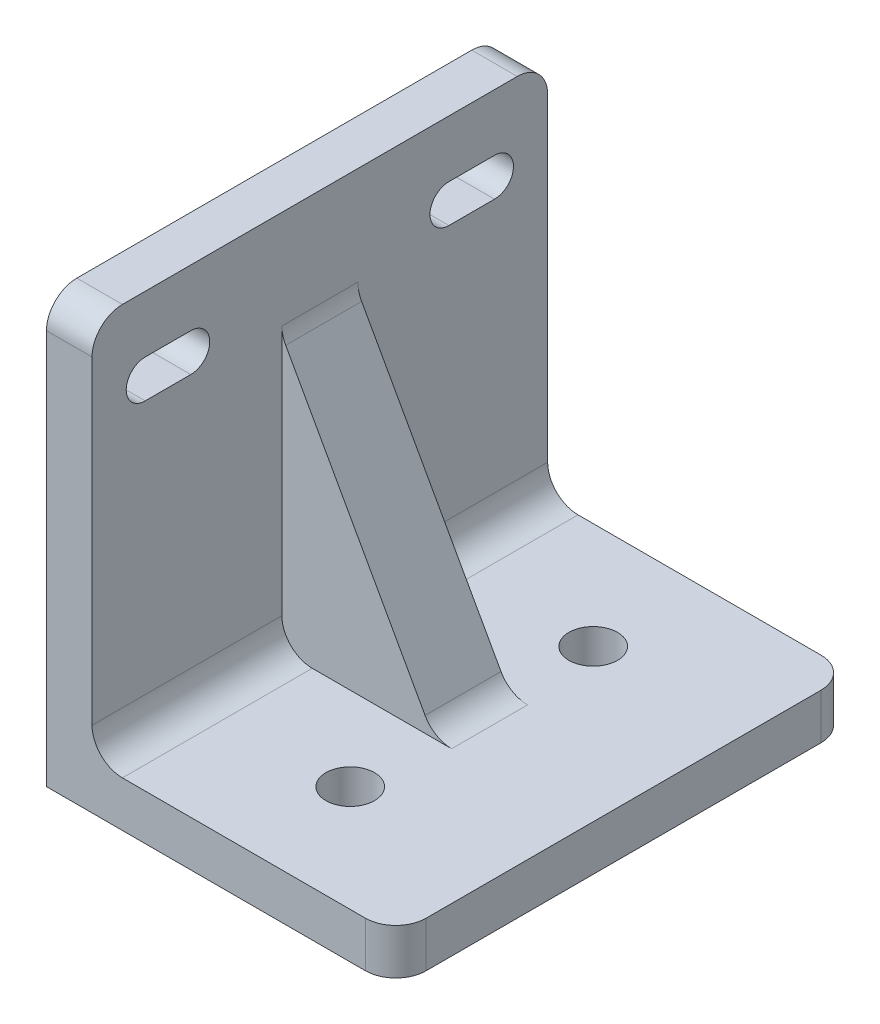
ISO-10303-21;
HEADER;
FILE_DESCRIPTION(('STEP AP214'),'2;1');
FILE_NAME('part.step','',(''),(''),'','','');
FILE_SCHEMA(('AUTOMOTIVE_DESIGN { 1 0 10303 214 1 1 1 1 }'));
ENDSEC;
DATA;
#1=APPLICATION_CONTEXT('core data for automotive mechanical design processes');
#2=APPLICATION_PROTOCOL_DEFINITION('international standard','automotive_design',2000,#1);
#3=PRODUCT_CONTEXT('',#1,'mechanical');
#4=PRODUCT('Part','Part','',(#3));
#5=PRODUCT_RELATED_PRODUCT_CATEGORY('part','',(#4));
#6=PRODUCT_DEFINITION_FORMATION('','',#4);
#7=PRODUCT_DEFINITION_CONTEXT('part definition',#1,'design');
#8=PRODUCT_DEFINITION('design','',#6,#7);
#9=PRODUCT_DEFINITION_SHAPE('','',#8);
#10=(LENGTH_UNIT() NAMED_UNIT(*) SI_UNIT(.MILLI.,.METRE.));
#11=(NAMED_UNIT(*) PLANE_ANGLE_UNIT() SI_UNIT($,.RADIAN.));
#12=(NAMED_UNIT(*) SI_UNIT($,.STERADIAN.) SOLID_ANGLE_UNIT());
#13=UNCERTAINTY_MEASURE_WITH_UNIT(LENGTH_MEASURE(1.E-05),#10,'distance_accuracy_value','');
#14=(GEOMETRIC_REPRESENTATION_CONTEXT(3) GLOBAL_UNCERTAINTY_ASSIGNED_CONTEXT((#13)) GLOBAL_UNIT_ASSIGNED_CONTEXT((#10,
#11,#12)) REPRESENTATION_CONTEXT('',''));
#15=CARTESIAN_POINT('',(0.,0.,0.));
#16=DIRECTION('',(0.,0.,1.));
#17=DIRECTION('',(1.,0.,0.));
#18=AXIS2_PLACEMENT_3D('',#15,#16,#17);
#19=CARTESIAN_POINT('',(20.,0.,15.));
#20=DIRECTION('',(0.,-1.,0.));
#21=DIRECTION('',(1.,0.,0.));
#22=AXIS2_PLACEMENT_3D('',#19,#20,#21);
#23=PLANE('',#22);
#24=CARTESIAN_POINT('',(10.,0.,8.));
#25=DIRECTION('',(0.,1.,0.));
#26=DIRECTION('',(-1.,0.,0.));
#27=AXIS2_PLACEMENT_3D('',#24,#25,#26);
#28=CIRCLE('',#27,1.6);
#29=CARTESIAN_POINT('',(8.4,0.,8.));
#30=VERTEX_POINT('',#29);
#31=EDGE_CURVE('E286',#30,#30,#28,.T.);
#32=ORIENTED_EDGE('',*,*,#31,.F.);
#33=EDGE_LOOP('',(#32));
#34=FACE_BOUND('',#33,.T.);
#35=CARTESIAN_POINT('',(10.,0.,-8.));
#36=DIRECTION('',(0.,1.,0.));
#37=DIRECTION('',(-1.,0.,0.));
#38=AXIS2_PLACEMENT_3D('',#35,#36,#37);
#39=CIRCLE('',#38,1.6);
#40=CARTESIAN_POINT('',(8.4,0.,-8.));
#41=VERTEX_POINT('',#40);
#42=EDGE_CURVE('E285',#41,#41,#39,.T.);
#43=ORIENTED_EDGE('',*,*,#42,.F.);
#44=EDGE_LOOP('',(#43));
#45=FACE_BOUND('',#44,.T.);
#46=DIRECTION('',(-1.,0.,0.));
#47=VECTOR('',#46,1.);
#48=CARTESIAN_POINT('',(20.,0.,15.));
#49=LINE('',#48,#47);
#50=CARTESIAN_POINT('',(18.,0.,15.));
#51=VERTEX_POINT('',#50);
#52=CARTESIAN_POINT('',(2.,0.,15.));
#53=VERTEX_POINT('',#52);
#54=EDGE_CURVE('E292',#51,#53,#49,.T.);
#55=ORIENTED_EDGE('',*,*,#54,.F.);
#56=CARTESIAN_POINT('',(18.,0.,13.));
#57=DIRECTION('',(0.,-1.,0.));
#58=DIRECTION('',(1.,0.,0.));
#59=AXIS2_PLACEMENT_3D('',#56,#57,#58);
#60=CIRCLE('',#59,2.);
#61=CARTESIAN_POINT('',(20.,0.,13.));
#62=VERTEX_POINT('',#61);
#63=EDGE_CURVE('E349',#51,#62,#60,.F.);
#64=ORIENTED_EDGE('',*,*,#63,.T.);
#65=DIRECTION('',(0.,0.,-1.));
#66=VECTOR('',#65,1.);
#67=CARTESIAN_POINT('',(20.,0.,15.));
#68=LINE('',#67,#66);
#69=CARTESIAN_POINT('',(20.,0.,-13.));
#70=VERTEX_POINT('',#69);
#71=EDGE_CURVE('E304',#62,#70,#68,.T.);
#72=ORIENTED_EDGE('',*,*,#71,.T.);
#73=CARTESIAN_POINT('',(18.,0.,-13.));
#74=DIRECTION('',(0.,-1.,0.));
#75=DIRECTION('',(1.,0.,0.));
#76=AXIS2_PLACEMENT_3D('',#73,#74,#75);
#77=CIRCLE('',#76,2.);
#78=CARTESIAN_POINT('',(18.,0.,-15.));
#79=VERTEX_POINT('',#78);
#80=EDGE_CURVE('E347',#70,#79,#77,.F.);
#81=ORIENTED_EDGE('',*,*,#80,.T.);
#82=DIRECTION('',(-1.,0.,0.));
#83=VECTOR('',#82,1.);
#84=CARTESIAN_POINT('',(20.,0.,-15.));
#85=LINE('',#84,#83);
#86=CARTESIAN_POINT('',(2.,0.,-15.));
#87=VERTEX_POINT('',#86);
#88=EDGE_CURVE('E305',#79,#87,#85,.T.);
#89=ORIENTED_EDGE('',*,*,#88,.T.);
#90=DIRECTION('',(0.,0.,-1.));
#91=VECTOR('',#90,1.);
#92=CARTESIAN_POINT('',(2.,0.,-2.5));
#93=LINE('',#92,#91);
#94=CARTESIAN_POINT('',(2.,0.,-2.5));
#95=VERTEX_POINT('',#94);
#96=EDGE_CURVE('E345',#87,#95,#93,.F.);
#97=ORIENTED_EDGE('',*,*,#96,.T.);
#98=DIRECTION('',(-1.,0.,0.));
#99=VECTOR('',#98,1.);
#100=CARTESIAN_POINT('',(20.,0.,-2.5));
#101=LINE('',#100,#99);
#102=CARTESIAN_POINT('',(11.1768066979971,0.,-2.5));
#103=VERTEX_POINT('',#102);
#104=EDGE_CURVE('E407',#103,#95,#101,.T.);
#105=ORIENTED_EDGE('',*,*,#104,.F.);
#106=DIRECTION('',(0.,0.,-1.));
#107=VECTOR('',#106,1.);
#108=CARTESIAN_POINT('',(11.1768066979971,0.,15.));
#109=LINE('',#108,#107);
#110=CARTESIAN_POINT('',(11.1768066979971,0.,2.5));
#111=VERTEX_POINT('',#110);
#112=EDGE_CURVE('E342',#103,#111,#109,.F.);
#113=ORIENTED_EDGE('',*,*,#112,.T.);
#114=DIRECTION('',(-1.,0.,0.));
#115=VECTOR('',#114,1.);
#116=CARTESIAN_POINT('',(20.,0.,2.5));
#117=LINE('',#116,#115);
#118=CARTESIAN_POINT('',(2.,0.,2.5));
#119=VERTEX_POINT('',#118);
#120=EDGE_CURVE('E254',#111,#119,#117,.T.);
#121=ORIENTED_EDGE('',*,*,#120,.T.);
#122=DIRECTION('',(0.,0.,-1.));
#123=VECTOR('',#122,1.);
#124=CARTESIAN_POINT('',(2.,0.,15.));
#125=LINE('',#124,#123);
#126=EDGE_CURVE('E340',#119,#53,#125,.F.);
#127=ORIENTED_EDGE('',*,*,#126,.T.);
#128=EDGE_LOOP('',(#55,#64,#72,#81,#89,#97,#105,#113,#121,#127));
#129=FACE_BOUND('',#128,.T.);
#130=ADVANCED_FACE('F41',(#34,#45,#129),#23,.F.);
#131=CARTESIAN_POINT('',(0.,0.,15.));
#132=DIRECTION('',(-1.,0.,0.));
#133=DIRECTION('',(0.,-1.,0.));
#134=AXIS2_PLACEMENT_3D('',#131,#132,#133);
#135=PLANE('',#134);
#136=DIRECTION('',(0.,0.,-1.));
#137=VECTOR('',#136,1.);
#138=CARTESIAN_POINT('',(0.,21.25,15.));
#139=LINE('',#138,#137);
#140=CARTESIAN_POINT('',(0.,21.25,-8.5));
#141=VERTEX_POINT('',#140);
#142=CARTESIAN_POINT('',(0.,21.25,-11.5));
#143=VERTEX_POINT('',#142);
#144=EDGE_CURVE('E279',#141,#143,#139,.T.);
#145=ORIENTED_EDGE('',*,*,#144,.T.);
#146=CARTESIAN_POINT('',(0.,20.,-11.5));
#147=DIRECTION('',(-1.,0.,0.));
#148=DIRECTION('',(0.,-1.,0.));
#149=AXIS2_PLACEMENT_3D('',#146,#147,#148);
#150=CIRCLE('',#149,1.25);
#151=CARTESIAN_POINT('',(0.,18.75,-11.5));
#152=VERTEX_POINT('',#151);
#153=EDGE_CURVE('E282',#143,#152,#150,.T.);
#154=ORIENTED_EDGE('',*,*,#153,.T.);
#155=DIRECTION('',(0.,0.,1.));
#156=VECTOR('',#155,1.);
#157=CARTESIAN_POINT('',(0.,18.75,15.));
#158=LINE('',#157,#156);
#159=CARTESIAN_POINT('',(0.,18.75,-8.5));
#160=VERTEX_POINT('',#159);
#161=EDGE_CURVE('E276',#152,#160,#158,.T.);
#162=ORIENTED_EDGE('',*,*,#161,.T.);
#163=CARTESIAN_POINT('',(0.,20.,-8.5));
#164=DIRECTION('',(-1.,0.,0.));
#165=DIRECTION('',(0.,-1.,0.));
#166=AXIS2_PLACEMENT_3D('',#163,#164,#165);
#167=CIRCLE('',#166,1.25);
#168=EDGE_CURVE('E216',#160,#141,#167,.T.);
#169=ORIENTED_EDGE('',*,*,#168,.T.);
#170=EDGE_LOOP('',(#145,#154,#162,#169));
#171=FACE_BOUND('',#170,.T.);
#172=DIRECTION('',(0.,0.,1.));
#173=VECTOR('',#172,1.);
#174=CARTESIAN_POINT('',(0.,18.75,15.));
#175=LINE('',#174,#173);
#176=CARTESIAN_POINT('',(0.,18.75,8.5));
#177=VERTEX_POINT('',#176);
#178=CARTESIAN_POINT('',(0.,18.75,11.5));
#179=VERTEX_POINT('',#178);
#180=EDGE_CURVE('E270',#177,#179,#175,.T.);
#181=ORIENTED_EDGE('',*,*,#180,.T.);
#182=CARTESIAN_POINT('',(0.,20.,11.5));
#183=DIRECTION('',(-1.,0.,0.));
#184=DIRECTION('',(0.,-1.,0.));
#185=AXIS2_PLACEMENT_3D('',#182,#183,#184);
#186=CIRCLE('',#185,1.25);
#187=CARTESIAN_POINT('',(0.,21.25,11.5));
#188=VERTEX_POINT('',#187);
#189=EDGE_CURVE('E273',#179,#188,#186,.T.);
#190=ORIENTED_EDGE('',*,*,#189,.T.);
#191=DIRECTION('',(0.,0.,-1.));
#192=VECTOR('',#191,1.);
#193=CARTESIAN_POINT('',(0.,21.25,15.));
#194=LINE('',#193,#192);
#195=CARTESIAN_POINT('',(0.,21.25,8.5));
#196=VERTEX_POINT('',#195);
#197=EDGE_CURVE('E241',#188,#196,#194,.T.);
#198=ORIENTED_EDGE('',*,*,#197,.T.);
#199=CARTESIAN_POINT('',(0.,20.,8.5));
#200=DIRECTION('',(-1.,0.,0.));
#201=DIRECTION('',(0.,-1.,0.));
#202=AXIS2_PLACEMENT_3D('',#199,#200,#201);
#203=CIRCLE('',#202,1.25);
#204=EDGE_CURVE('E267',#196,#177,#203,.T.);
#205=ORIENTED_EDGE('',*,*,#204,.T.);
#206=EDGE_LOOP('',(#181,#190,#198,#205));
#207=FACE_BOUND('',#206,.T.);
#208=DIRECTION('',(0.,1.,0.));
#209=VECTOR('',#208,1.);
#210=CARTESIAN_POINT('',(0.,0.,-15.));
#211=LINE('',#210,#209);
#212=CARTESIAN_POINT('',(0.,2.,-15.));
#213=VERTEX_POINT('',#212);
#214=CARTESIAN_POINT('',(0.,23.,-15.));
#215=VERTEX_POINT('',#214);
#216=EDGE_CURVE('E308',#213,#215,#211,.T.);
#217=ORIENTED_EDGE('',*,*,#216,.T.);
#218=CARTESIAN_POINT('',(0.,23.,-13.));
#219=DIRECTION('',(-1.,0.,0.));
#220=DIRECTION('',(0.,-1.,0.));
#221=AXIS2_PLACEMENT_3D('',#218,#219,#220);
#222=CIRCLE('',#221,2.);
#223=CARTESIAN_POINT('',(0.,25.,-13.));
#224=VERTEX_POINT('',#223);
#225=EDGE_CURVE('E384',#215,#224,#222,.F.);
#226=ORIENTED_EDGE('',*,*,#225,.T.);
#227=DIRECTION('',(0.,0.,-1.));
#228=VECTOR('',#227,1.);
#229=CARTESIAN_POINT('',(0.,25.,15.));
#230=LINE('',#229,#228);
#231=CARTESIAN_POINT('',(0.,25.,13.));
#232=VERTEX_POINT('',#231);
#233=EDGE_CURVE('E327',#232,#224,#230,.T.);
#234=ORIENTED_EDGE('',*,*,#233,.F.);
#235=CARTESIAN_POINT('',(0.,23.,13.));
#236=DIRECTION('',(-1.,0.,0.));
#237=DIRECTION('',(0.,-1.,0.));
#238=AXIS2_PLACEMENT_3D('',#235,#236,#237);
#239=CIRCLE('',#238,2.);
#240=CARTESIAN_POINT('',(0.,23.,15.));
#241=VERTEX_POINT('',#240);
#242=EDGE_CURVE('E382',#232,#241,#239,.F.);
#243=ORIENTED_EDGE('',*,*,#242,.T.);
#244=DIRECTION('',(0.,1.,0.));
#245=VECTOR('',#244,1.);
#246=CARTESIAN_POINT('',(0.,0.,15.));
#247=LINE('',#246,#245);
#248=CARTESIAN_POINT('',(0.,2.,15.));
#249=VERTEX_POINT('',#248);
#250=EDGE_CURVE('E295',#249,#241,#247,.T.);
#251=ORIENTED_EDGE('',*,*,#250,.F.);
#252=DIRECTION('',(0.,0.,-1.));
#253=VECTOR('',#252,1.);
#254=CARTESIAN_POINT('',(0.,2.,2.5));
#255=LINE('',#254,#253);
#256=CARTESIAN_POINT('',(0.,2.,2.5));
#257=VERTEX_POINT('',#256);
#258=EDGE_CURVE('E373',#249,#257,#255,.T.);
#259=ORIENTED_EDGE('',*,*,#258,.T.);
#260=DIRECTION('',(0.,1.,0.));
#261=VECTOR('',#260,1.);
#262=CARTESIAN_POINT('',(0.,0.,2.5));
#263=LINE('',#262,#261);
#264=CARTESIAN_POINT('',(0.,18.5182520563948,2.5));
#265=VERTEX_POINT('',#264);
#266=EDGE_CURVE('E418',#257,#265,#263,.T.);
#267=ORIENTED_EDGE('',*,*,#266,.T.);
#268=DIRECTION('',(0.,0.,1.));
#269=VECTOR('',#268,1.);
#270=CARTESIAN_POINT('',(0.,18.5182520563948,15.));
#271=LINE('',#270,#269);
#272=CARTESIAN_POINT('',(0.,18.5182520563948,-2.5));
#273=VERTEX_POINT('',#272);
#274=EDGE_CURVE('E379',#265,#273,#271,.F.);
#275=ORIENTED_EDGE('',*,*,#274,.T.);
#276=DIRECTION('',(0.,1.,0.));
#277=VECTOR('',#276,1.);
#278=CARTESIAN_POINT('',(0.,0.,-2.5));
#279=LINE('',#278,#277);
#280=CARTESIAN_POINT('',(0.,2.,-2.5));
#281=VERTEX_POINT('',#280);
#282=EDGE_CURVE('E419',#281,#273,#279,.T.);
#283=ORIENTED_EDGE('',*,*,#282,.F.);
#284=DIRECTION('',(0.,0.,-1.));
#285=VECTOR('',#284,1.);
#286=CARTESIAN_POINT('',(0.,2.,-15.));
#287=LINE('',#286,#285);
#288=EDGE_CURVE('E376',#281,#213,#287,.T.);
#289=ORIENTED_EDGE('',*,*,#288,.T.);
#290=EDGE_LOOP('',(#217,#226,#234,#243,#251,#259,#267,#275,#283,#289));
#291=FACE_BOUND('',#290,.T.);
#292=ADVANCED_FACE('F432',(#171,#207,#291),#135,.F.);
#293=CARTESIAN_POINT('',(0.,25.,15.));
#294=DIRECTION('',(0.,-1.,0.));
#295=DIRECTION('',(1.,0.,0.));
#296=AXIS2_PLACEMENT_3D('',#293,#294,#295);
#297=PLANE('',#296);
#298=ORIENTED_EDGE('',*,*,#233,.T.);
#299=DIRECTION('',(-1.,0.,0.));
#300=VECTOR('',#299,1.);
#301=CARTESIAN_POINT('',(-3.,25.,-13.));
#302=LINE('',#301,#300);
#303=CARTESIAN_POINT('',(-3.,25.,-13.));
#304=VERTEX_POINT('',#303);
#305=EDGE_CURVE('E366',#224,#304,#302,.T.);
#306=ORIENTED_EDGE('',*,*,#305,.T.);
#307=DIRECTION('',(0.,0.,-1.));
#308=VECTOR('',#307,1.);
#309=CARTESIAN_POINT('',(-3.,25.,15.));
#310=LINE('',#309,#308);
#311=CARTESIAN_POINT('',(-3.,25.,13.));
#312=VERTEX_POINT('',#311);
#313=EDGE_CURVE('E324',#312,#304,#310,.T.);
#314=ORIENTED_EDGE('',*,*,#313,.F.);
#315=DIRECTION('',(-1.,0.,0.));
#316=VECTOR('',#315,1.);
#317=CARTESIAN_POINT('',(0.,25.,13.));
#318=LINE('',#317,#316);
#319=EDGE_CURVE('E364',#312,#232,#318,.F.);
#320=ORIENTED_EDGE('',*,*,#319,.T.);
#321=EDGE_LOOP('',(#298,#306,#314,#320));
#322=FACE_BOUND('',#321,.T.);
#323=ADVANCED_FACE('F435',(#322),#297,.F.);
#324=CARTESIAN_POINT('',(-3.,25.,15.));
#325=DIRECTION('',(1.,0.,0.));
#326=DIRECTION('',(0.,1.,0.));
#327=AXIS2_PLACEMENT_3D('',#324,#325,#326);
#328=PLANE('',#327);
#329=ORIENTED_EDGE('',*,*,#313,.T.);
#330=CARTESIAN_POINT('',(-3.,23.,-13.));
#331=DIRECTION('',(1.,0.,0.));
#332=DIRECTION('',(0.,1.,0.));
#333=AXIS2_PLACEMENT_3D('',#330,#331,#332);
#334=CIRCLE('',#333,2.);
#335=CARTESIAN_POINT('',(-3.,23.,-15.));
#336=VERTEX_POINT('',#335);
#337=EDGE_CURVE('E371',#304,#336,#334,.F.);
#338=ORIENTED_EDGE('',*,*,#337,.T.);
#339=DIRECTION('',(0.,-1.,0.));
#340=VECTOR('',#339,1.);
#341=CARTESIAN_POINT('',(-3.,25.,-15.));
#342=LINE('',#341,#340);
#343=CARTESIAN_POINT('',(-3.,-3.,-15.));
#344=VERTEX_POINT('',#343);
#345=EDGE_CURVE('E312',#336,#344,#342,.T.);
#346=ORIENTED_EDGE('',*,*,#345,.T.);
#347=DIRECTION('',(0.,0.,-1.));
#348=VECTOR('',#347,1.);
#349=CARTESIAN_POINT('',(-3.,-3.,15.));
#350=LINE('',#349,#348);
#351=CARTESIAN_POINT('',(-3.,-3.,15.));
#352=VERTEX_POINT('',#351);
#353=EDGE_CURVE('E321',#352,#344,#350,.T.);
#354=ORIENTED_EDGE('',*,*,#353,.F.);
#355=DIRECTION('',(0.,-1.,0.));
#356=VECTOR('',#355,1.);
#357=CARTESIAN_POINT('',(-3.,25.,15.));
#358=LINE('',#357,#356);
#359=CARTESIAN_POINT('',(-3.,23.,15.));
#360=VERTEX_POINT('',#359);
#361=EDGE_CURVE('E299',#360,#352,#358,.T.);
#362=ORIENTED_EDGE('',*,*,#361,.F.);
#363=CARTESIAN_POINT('',(-3.,23.,13.));
#364=DIRECTION('',(1.,0.,0.));
#365=DIRECTION('',(0.,1.,0.));
#366=AXIS2_PLACEMENT_3D('',#363,#364,#365);
#367=CIRCLE('',#366,2.);
#368=EDGE_CURVE('E369',#360,#312,#367,.F.);
#369=ORIENTED_EDGE('',*,*,#368,.T.);
#370=EDGE_LOOP('',(#329,#338,#346,#354,#362,#369));
#371=FACE_BOUND('',#370,.T.);
#372=DIRECTION('',(0.,0.,1.));
#373=VECTOR('',#372,1.);
#374=CARTESIAN_POINT('',(-3.,18.75,-11.5));
#375=LINE('',#374,#373);
#376=CARTESIAN_POINT('',(-3.,18.75,-11.5));
#377=VERTEX_POINT('',#376);
#378=CARTESIAN_POINT('',(-3.,18.75,-8.5));
#379=VERTEX_POINT('',#378);
#380=EDGE_CURVE('E224',#377,#379,#375,.T.);
#381=ORIENTED_EDGE('',*,*,#380,.F.);
#382=CARTESIAN_POINT('',(-3.,20.,-11.5));
#383=DIRECTION('',(-1.,0.,0.));
#384=DIRECTION('',(0.,-1.,0.));
#385=AXIS2_PLACEMENT_3D('',#382,#383,#384);
#386=CIRCLE('',#385,1.25);
#387=CARTESIAN_POINT('',(-3.,21.25,-11.5));
#388=VERTEX_POINT('',#387);
#389=EDGE_CURVE('E229',#388,#377,#386,.T.);
#390=ORIENTED_EDGE('',*,*,#389,.F.);
#391=DIRECTION('',(0.,0.,-1.));
#392=VECTOR('',#391,1.);
#393=CARTESIAN_POINT('',(-3.,21.25,-11.5));
#394=LINE('',#393,#392);
#395=CARTESIAN_POINT('',(-3.,21.25,-8.5));
#396=VERTEX_POINT('',#395);
#397=EDGE_CURVE('E234',#396,#388,#394,.T.);
#398=ORIENTED_EDGE('',*,*,#397,.F.);
#399=CARTESIAN_POINT('',(-3.,20.,-8.5));
#400=DIRECTION('',(-1.,0.,0.));
#401=DIRECTION('',(0.,-1.,0.));
#402=AXIS2_PLACEMENT_3D('',#399,#400,#401);
#403=CIRCLE('',#402,1.25);
#404=EDGE_CURVE('E213',#379,#396,#403,.T.);
#405=ORIENTED_EDGE('',*,*,#404,.F.);
#406=EDGE_LOOP('',(#381,#390,#398,#405));
#407=FACE_BOUND('',#406,.T.);
#408=DIRECTION('',(0.,0.,-1.));
#409=VECTOR('',#408,1.);
#410=CARTESIAN_POINT('',(-3.,21.25,11.5));
#411=LINE('',#410,#409);
#412=CARTESIAN_POINT('',(-3.,21.25,11.5));
#413=VERTEX_POINT('',#412);
#414=CARTESIAN_POINT('',(-3.,21.25,8.5));
#415=VERTEX_POINT('',#414);
#416=EDGE_CURVE('E260',#413,#415,#411,.T.);
#417=ORIENTED_EDGE('',*,*,#416,.F.);
#418=CARTESIAN_POINT('',(-3.,20.,11.5));
#419=DIRECTION('',(-1.,0.,0.));
#420=DIRECTION('',(0.,1.,0.));
#421=AXIS2_PLACEMENT_3D('',#418,#419,#420);
#422=CIRCLE('',#421,1.25);
#423=CARTESIAN_POINT('',(-3.,18.75,11.5));
#424=VERTEX_POINT('',#423);
#425=EDGE_CURVE('E263',#424,#413,#422,.T.);
#426=ORIENTED_EDGE('',*,*,#425,.F.);
#427=DIRECTION('',(0.,0.,1.));
#428=VECTOR('',#427,1.);
#429=CARTESIAN_POINT('',(-3.,18.75,11.5));
#430=LINE('',#429,#428);
#431=CARTESIAN_POINT('',(-3.,18.75,8.5));
#432=VERTEX_POINT('',#431);
#433=EDGE_CURVE('E247',#432,#424,#430,.T.);
#434=ORIENTED_EDGE('',*,*,#433,.F.);
#435=CARTESIAN_POINT('',(-3.,20.,8.5));
#436=DIRECTION('',(-1.,0.,0.));
#437=DIRECTION('',(0.,1.,0.));
#438=AXIS2_PLACEMENT_3D('',#435,#436,#437);
#439=CIRCLE('',#438,1.25);
#440=EDGE_CURVE('E257',#415,#432,#439,.T.);
#441=ORIENTED_EDGE('',*,*,#440,.F.);
#442=EDGE_LOOP('',(#417,#426,#434,#441));
#443=FACE_BOUND('',#442,.T.);
#444=ADVANCED_FACE('F231',(#371,#407,#443),#328,.F.);
#445=CARTESIAN_POINT('',(-3.,-3.,15.));
#446=DIRECTION('',(0.,1.,0.));
#447=DIRECTION('',(-1.,0.,0.));
#448=AXIS2_PLACEMENT_3D('',#445,#446,#447);
#449=PLANE('',#448);
#450=CARTESIAN_POINT('',(10.,-3.,8.));
#451=DIRECTION('',(0.,1.,0.));
#452=DIRECTION('',(-1.,0.,0.));
#453=AXIS2_PLACEMENT_3D('',#450,#451,#452);
#454=CIRCLE('',#453,1.6);
#455=CARTESIAN_POINT('',(8.4,-3.,8.));
#456=VERTEX_POINT('',#455);
#457=EDGE_CURVE('E309',#456,#456,#454,.T.);
#458=ORIENTED_EDGE('',*,*,#457,.T.);
#459=EDGE_LOOP('',(#458));
#460=FACE_BOUND('',#459,.T.);
#461=CARTESIAN_POINT('',(10.,-3.,-8.));
#462=DIRECTION('',(0.,1.,0.));
#463=DIRECTION('',(-1.,0.,0.));
#464=AXIS2_PLACEMENT_3D('',#461,#462,#463);
#465=CIRCLE('',#464,1.6);
#466=CARTESIAN_POINT('',(8.4,-3.,-8.));
#467=VERTEX_POINT('',#466);
#468=EDGE_CURVE('E289',#467,#467,#465,.T.);
#469=ORIENTED_EDGE('',*,*,#468,.T.);
#470=EDGE_LOOP('',(#469));
#471=FACE_BOUND('',#470,.T.);
#472=DIRECTION('',(0.,0.,-1.));
#473=VECTOR('',#472,1.);
#474=CARTESIAN_POINT('',(20.,-3.,15.));
#475=LINE('',#474,#473);
#476=CARTESIAN_POINT('',(20.,-3.,13.));
#477=VERTEX_POINT('',#476);
#478=CARTESIAN_POINT('',(20.,-3.,-13.));
#479=VERTEX_POINT('',#478);
#480=EDGE_CURVE('E318',#477,#479,#475,.T.);
#481=ORIENTED_EDGE('',*,*,#480,.F.);
#482=CARTESIAN_POINT('',(18.,-3.,13.));
#483=DIRECTION('',(0.,1.,0.));
#484=DIRECTION('',(-1.,0.,0.));
#485=AXIS2_PLACEMENT_3D('',#482,#483,#484);
#486=CIRCLE('',#485,2.);
#487=CARTESIAN_POINT('',(18.,-3.,15.));
#488=VERTEX_POINT('',#487);
#489=EDGE_CURVE('E358',#477,#488,#486,.F.);
#490=ORIENTED_EDGE('',*,*,#489,.T.);
#491=DIRECTION('',(1.,0.,0.));
#492=VECTOR('',#491,1.);
#493=CARTESIAN_POINT('',(-3.,-3.,15.));
#494=LINE('',#493,#492);
#495=EDGE_CURVE('E301',#352,#488,#494,.T.);
#496=ORIENTED_EDGE('',*,*,#495,.F.);
#497=ORIENTED_EDGE('',*,*,#353,.T.);
#498=DIRECTION('',(1.,0.,0.));
#499=VECTOR('',#498,1.);
#500=CARTESIAN_POINT('',(-3.,-3.,-15.));
#501=LINE('',#500,#499);
#502=CARTESIAN_POINT('',(18.,-3.,-15.));
#503=VERTEX_POINT('',#502);
#504=EDGE_CURVE('E296',#344,#503,#501,.T.);
#505=ORIENTED_EDGE('',*,*,#504,.T.);
#506=CARTESIAN_POINT('',(18.,-3.,-13.));
#507=DIRECTION('',(0.,1.,0.));
#508=DIRECTION('',(-1.,0.,0.));
#509=AXIS2_PLACEMENT_3D('',#506,#507,#508);
#510=CIRCLE('',#509,2.);
#511=EDGE_CURVE('E356',#503,#479,#510,.F.);
#512=ORIENTED_EDGE('',*,*,#511,.T.);
#513=EDGE_LOOP('',(#481,#490,#496,#497,#505,#512));
#514=FACE_BOUND('',#513,.T.);
#515=ADVANCED_FACE('F690',(#460,#471,#514),#449,.F.);
#516=CARTESIAN_POINT('',(20.,-3.,15.));
#517=DIRECTION('',(-1.,0.,0.));
#518=DIRECTION('',(0.,0.,1.));
#519=AXIS2_PLACEMENT_3D('',#516,#517,#518);
#520=PLANE('',#519);
#521=ORIENTED_EDGE('',*,*,#71,.F.);
#522=DIRECTION('',(0.,1.,0.));
#523=VECTOR('',#522,1.);
#524=CARTESIAN_POINT('',(20.,-3.,13.));
#525=LINE('',#524,#523);
#526=EDGE_CURVE('E354',#62,#477,#525,.F.);
#527=ORIENTED_EDGE('',*,*,#526,.T.);
#528=ORIENTED_EDGE('',*,*,#480,.T.);
#529=DIRECTION('',(0.,1.,0.));
#530=VECTOR('',#529,1.);
#531=CARTESIAN_POINT('',(20.,0.,-13.));
#532=LINE('',#531,#530);
#533=EDGE_CURVE('E351',#479,#70,#532,.T.);
#534=ORIENTED_EDGE('',*,*,#533,.T.);
#535=EDGE_LOOP('',(#521,#527,#528,#534));
#536=FACE_BOUND('',#535,.T.);
#537=ADVANCED_FACE('F681',(#536),#520,.F.);
#538=CARTESIAN_POINT('',(0.,0.,15.));
#539=DIRECTION('',(0.,0.,-1.));
#540=DIRECTION('',(-1.,0.,0.));
#541=AXIS2_PLACEMENT_3D('',#538,#539,#540);
#542=PLANE('',#541);
#543=ORIENTED_EDGE('',*,*,#495,.T.);
#544=DIRECTION('',(0.,1.,0.));
#545=VECTOR('',#544,1.);
#546=CARTESIAN_POINT('',(18.,0.,15.));
#547=LINE('',#546,#545);
#548=EDGE_CURVE('E337',#488,#51,#547,.T.);
#549=ORIENTED_EDGE('',*,*,#548,.T.);
#550=ORIENTED_EDGE('',*,*,#54,.T.);
#551=CARTESIAN_POINT('',(2.,2.,15.));
#552=DIRECTION('',(0.,0.,-1.));
#553=DIRECTION('',(-1.,0.,0.));
#554=AXIS2_PLACEMENT_3D('',#551,#552,#553);
#555=CIRCLE('',#554,2.);
#556=EDGE_CURVE('E11',#53,#249,#555,.T.);
#557=ORIENTED_EDGE('',*,*,#556,.T.);
#558=ORIENTED_EDGE('',*,*,#250,.T.);
#559=DIRECTION('',(-1.,0.,0.));
#560=VECTOR('',#559,1.);
#561=CARTESIAN_POINT('',(0.,23.,15.));
#562=LINE('',#561,#560);
#563=EDGE_CURVE('E330',#241,#360,#562,.T.);
#564=ORIENTED_EDGE('',*,*,#563,.T.);
#565=ORIENTED_EDGE('',*,*,#361,.T.);
#566=EDGE_LOOP('',(#543,#549,#550,#557,#558,#564,#565));
#567=FACE_BOUND('',#566,.T.);
#568=ADVANCED_FACE('F460',(#567),#542,.F.);
#569=CARTESIAN_POINT('',(0.,0.,-15.));
#570=DIRECTION('',(0.,0.,-1.));
#571=DIRECTION('',(-1.,0.,0.));
#572=AXIS2_PLACEMENT_3D('',#569,#570,#571);
#573=PLANE('',#572);
#574=ORIENTED_EDGE('',*,*,#88,.F.);
#575=DIRECTION('',(0.,1.,0.));
#576=VECTOR('',#575,1.);
#577=CARTESIAN_POINT('',(18.,-3.,-15.));
#578=LINE('',#577,#576);
#579=EDGE_CURVE('E362',#79,#503,#578,.F.);
#580=ORIENTED_EDGE('',*,*,#579,.T.);
#581=ORIENTED_EDGE('',*,*,#504,.F.);
#582=ORIENTED_EDGE('',*,*,#345,.F.);
#583=DIRECTION('',(-1.,0.,0.));
#584=VECTOR('',#583,1.);
#585=CARTESIAN_POINT('',(0.,23.,-15.));
#586=LINE('',#585,#584);
#587=EDGE_CURVE('E360',#336,#215,#586,.F.);
#588=ORIENTED_EDGE('',*,*,#587,.T.);
#589=ORIENTED_EDGE('',*,*,#216,.F.);
#590=CARTESIAN_POINT('',(2.,2.,-15.));
#591=DIRECTION('',(0.,0.,-1.));
#592=DIRECTION('',(-1.,0.,0.));
#593=AXIS2_PLACEMENT_3D('',#590,#591,#592);
#594=CIRCLE('',#593,2.);
#595=EDGE_CURVE('E398',#213,#87,#594,.F.);
#596=ORIENTED_EDGE('',*,*,#595,.T.);
#597=EDGE_LOOP('',(#574,#580,#581,#582,#588,#589,#596));
#598=FACE_BOUND('',#597,.T.);
#599=ADVANCED_FACE('F664',(#598),#573,.T.);
#600=CARTESIAN_POINT('',(10.,-25.,-8.));
#601=DIRECTION('',(0.,1.,0.));
#602=DIRECTION('',(-1.,0.,0.));
#603=AXIS2_PLACEMENT_3D('',#600,#601,#602);
#604=CYLINDRICAL_SURFACE('',#603,1.6);
#605=ORIENTED_EDGE('',*,*,#42,.T.);
#606=EDGE_LOOP('',(#605));
#607=FACE_BOUND('',#606,.T.);
#608=ORIENTED_EDGE('',*,*,#468,.F.);
#609=EDGE_LOOP('',(#608));
#610=FACE_BOUND('',#609,.T.);
#611=ADVANCED_FACE('F654',(#607,#610),#604,.F.);
#612=CARTESIAN_POINT('',(10.,-25.,8.));
#613=DIRECTION('',(0.,1.,0.));
#614=DIRECTION('',(-1.,0.,0.));
#615=AXIS2_PLACEMENT_3D('',#612,#613,#614);
#616=CYLINDRICAL_SURFACE('',#615,1.6);
#617=ORIENTED_EDGE('',*,*,#31,.T.);
#618=EDGE_LOOP('',(#617));
#619=FACE_BOUND('',#618,.T.);
#620=ORIENTED_EDGE('',*,*,#457,.F.);
#621=EDGE_LOOP('',(#620));
#622=FACE_BOUND('',#621,.T.);
#623=ADVANCED_FACE('F644',(#619,#622),#616,.F.);
#624=CARTESIAN_POINT('',(22.,20.,11.5));
#625=DIRECTION('',(-1.,0.,0.));
#626=DIRECTION('',(0.,-1.,0.));
#627=AXIS2_PLACEMENT_3D('',#624,#625,#626);
#628=CYLINDRICAL_SURFACE('',#627,1.25);
#629=DIRECTION('',(-1.,0.,0.));
#630=VECTOR('',#629,1.);
#631=CARTESIAN_POINT('',(22.,18.75,11.5));
#632=LINE('',#631,#630);
#633=EDGE_CURVE('E252',#179,#424,#632,.T.);
#634=ORIENTED_EDGE('',*,*,#633,.T.);
#635=ORIENTED_EDGE('',*,*,#425,.T.);
#636=DIRECTION('',(-1.,0.,0.));
#637=VECTOR('',#636,1.);
#638=CARTESIAN_POINT('',(22.,21.25,11.5));
#639=LINE('',#638,#637);
#640=EDGE_CURVE('E244',#188,#413,#639,.T.);
#641=ORIENTED_EDGE('',*,*,#640,.F.);
#642=ORIENTED_EDGE('',*,*,#189,.F.);
#643=EDGE_LOOP('',(#634,#635,#641,#642));
#644=FACE_BOUND('',#643,.T.);
#645=ADVANCED_FACE('F634',(#644),#628,.F.);
#646=CARTESIAN_POINT('',(22.,18.75,11.5));
#647=DIRECTION('',(0.,-1.,0.));
#648=DIRECTION('',(1.,0.,0.));
#649=AXIS2_PLACEMENT_3D('',#646,#647,#648);
#650=PLANE('',#649);
#651=DIRECTION('',(-1.,0.,0.));
#652=VECTOR('',#651,1.);
#653=CARTESIAN_POINT('',(22.,18.75,8.5));
#654=LINE('',#653,#652);
#655=EDGE_CURVE('E250',#177,#432,#654,.T.);
#656=ORIENTED_EDGE('',*,*,#655,.T.);
#657=ORIENTED_EDGE('',*,*,#433,.T.);
#658=ORIENTED_EDGE('',*,*,#633,.F.);
#659=ORIENTED_EDGE('',*,*,#180,.F.);
#660=EDGE_LOOP('',(#656,#657,#658,#659));
#661=FACE_BOUND('',#660,.T.);
#662=ADVANCED_FACE('F624',(#661),#650,.F.);
#663=CARTESIAN_POINT('',(22.,20.,8.5));
#664=DIRECTION('',(-1.,0.,0.));
#665=DIRECTION('',(0.,-1.,0.));
#666=AXIS2_PLACEMENT_3D('',#663,#664,#665);
#667=CYLINDRICAL_SURFACE('',#666,1.25);
#668=DIRECTION('',(-1.,0.,0.));
#669=VECTOR('',#668,1.);
#670=CARTESIAN_POINT('',(22.,21.25,8.5));
#671=LINE('',#670,#669);
#672=EDGE_CURVE('E248',#196,#415,#671,.T.);
#673=ORIENTED_EDGE('',*,*,#672,.T.);
#674=ORIENTED_EDGE('',*,*,#440,.T.);
#675=ORIENTED_EDGE('',*,*,#655,.F.);
#676=ORIENTED_EDGE('',*,*,#204,.F.);
#677=EDGE_LOOP('',(#673,#674,#675,#676));
#678=FACE_BOUND('',#677,.T.);
#679=ADVANCED_FACE('F614',(#678),#667,.F.);
#680=CARTESIAN_POINT('',(22.,21.25,11.5));
#681=DIRECTION('',(0.,1.,0.));
#682=DIRECTION('',(-1.,0.,0.));
#683=AXIS2_PLACEMENT_3D('',#680,#681,#682);
#684=PLANE('',#683);
#685=ORIENTED_EDGE('',*,*,#640,.T.);
#686=ORIENTED_EDGE('',*,*,#416,.T.);
#687=ORIENTED_EDGE('',*,*,#672,.F.);
#688=ORIENTED_EDGE('',*,*,#197,.F.);
#689=EDGE_LOOP('',(#685,#686,#687,#688));
#690=FACE_BOUND('',#689,.T.);
#691=ADVANCED_FACE('F605',(#690),#684,.F.);
#692=CARTESIAN_POINT('',(22.,20.,-11.5));
#693=DIRECTION('',(-1.,0.,0.));
#694=DIRECTION('',(0.,-1.,0.));
#695=AXIS2_PLACEMENT_3D('',#692,#693,#694);
#696=CYLINDRICAL_SURFACE('',#695,1.25);
#697=DIRECTION('',(-1.,0.,0.));
#698=VECTOR('',#697,1.);
#699=CARTESIAN_POINT('',(22.,21.25,-11.5));
#700=LINE('',#699,#698);
#701=EDGE_CURVE('E239',#143,#388,#700,.T.);
#702=ORIENTED_EDGE('',*,*,#701,.T.);
#703=ORIENTED_EDGE('',*,*,#389,.T.);
#704=DIRECTION('',(-1.,0.,0.));
#705=VECTOR('',#704,1.);
#706=CARTESIAN_POINT('',(22.,18.75,-11.5));
#707=LINE('',#706,#705);
#708=EDGE_CURVE('E220',#152,#377,#707,.T.);
#709=ORIENTED_EDGE('',*,*,#708,.F.);
#710=ORIENTED_EDGE('',*,*,#153,.F.);
#711=EDGE_LOOP('',(#702,#703,#709,#710));
#712=FACE_BOUND('',#711,.T.);
#713=ADVANCED_FACE('F427',(#712),#696,.F.);
#714=CARTESIAN_POINT('',(22.,21.25,-11.5));
#715=DIRECTION('',(0.,1.,0.));
#716=DIRECTION('',(-1.,0.,0.));
#717=AXIS2_PLACEMENT_3D('',#714,#715,#716);
#718=PLANE('',#717);
#719=DIRECTION('',(-1.,0.,0.));
#720=VECTOR('',#719,1.);
#721=CARTESIAN_POINT('',(22.,21.25,-8.5));
#722=LINE('',#721,#720);
#723=EDGE_CURVE('E219',#141,#396,#722,.T.);
#724=ORIENTED_EDGE('',*,*,#723,.T.);
#725=ORIENTED_EDGE('',*,*,#397,.T.);
#726=ORIENTED_EDGE('',*,*,#701,.F.);
#727=ORIENTED_EDGE('',*,*,#144,.F.);
#728=EDGE_LOOP('',(#724,#725,#726,#727));
#729=FACE_BOUND('',#728,.T.);
#730=ADVANCED_FACE('F430',(#729),#718,.F.);
#731=CARTESIAN_POINT('',(22.,20.,-8.5));
#732=DIRECTION('',(-1.,0.,0.));
#733=DIRECTION('',(0.,-1.,0.));
#734=AXIS2_PLACEMENT_3D('',#731,#732,#733);
#735=CYLINDRICAL_SURFACE('',#734,1.25);
#736=DIRECTION('',(-1.,0.,0.));
#737=VECTOR('',#736,1.);
#738=CARTESIAN_POINT('',(22.,18.75,-8.5));
#739=LINE('',#738,#737);
#740=EDGE_CURVE('E208',#160,#379,#739,.T.);
#741=ORIENTED_EDGE('',*,*,#740,.T.);
#742=ORIENTED_EDGE('',*,*,#404,.T.);
#743=ORIENTED_EDGE('',*,*,#723,.F.);
#744=ORIENTED_EDGE('',*,*,#168,.F.);
#745=EDGE_LOOP('',(#741,#742,#743,#744));
#746=FACE_BOUND('',#745,.T.);
#747=ADVANCED_FACE('F210',(#746),#735,.F.);
#748=CARTESIAN_POINT('',(22.,18.75,-11.5));
#749=DIRECTION('',(0.,-1.,0.));
#750=DIRECTION('',(1.,0.,0.));
#751=AXIS2_PLACEMENT_3D('',#748,#749,#750);
#752=PLANE('',#751);
#753=ORIENTED_EDGE('',*,*,#708,.T.);
#754=ORIENTED_EDGE('',*,*,#380,.T.);
#755=ORIENTED_EDGE('',*,*,#740,.F.);
#756=ORIENTED_EDGE('',*,*,#161,.F.);
#757=EDGE_LOOP('',(#753,#754,#755,#756));
#758=FACE_BOUND('',#757,.T.);
#759=ADVANCED_FACE('F225',(#758),#752,.F.);
#760=CARTESIAN_POINT('',(0.,18.,0.));
#761=DIRECTION('',(-0.874157276121538,-0.485642931178632,0.));
#762=DIRECTION('',(0.485642931178632,-0.874157276121538,0.));
#763=AXIS2_PLACEMENT_3D('',#760,#761,#762);
#764=PLANE('',#763);
#765=DIRECTION('',(0.485642931178632,-0.874157276121538,0.));
#766=VECTOR('',#765,1.);
#767=CARTESIAN_POINT('',(0.,18.,-2.5));
#768=LINE('',#767,#766);
#769=CARTESIAN_POINT('',(0.251685447756923,17.5469661940375,-2.5));
#770=VERTEX_POINT('',#769);
#771=CARTESIAN_POINT('',(9.42849214575403,1.02871413764273,-2.5));
#772=VERTEX_POINT('',#771);
#773=EDGE_CURVE('E409',#770,#772,#768,.T.);
#774=ORIENTED_EDGE('',*,*,#773,.F.);
#775=DIRECTION('',(0.,0.,-1.));
#776=VECTOR('',#775,1.);
#777=CARTESIAN_POINT('',(0.251685447756923,17.5469661940375,0.));
#778=LINE('',#777,#776);
#779=CARTESIAN_POINT('',(0.251685447756923,17.5469661940375,2.5));
#780=VERTEX_POINT('',#779);
#781=EDGE_CURVE('E63',#770,#780,#778,.F.);
#782=ORIENTED_EDGE('',*,*,#781,.T.);
#783=DIRECTION('',(0.485642931178632,-0.874157276121538,0.));
#784=VECTOR('',#783,1.);
#785=CARTESIAN_POINT('',(0.,18.,2.5));
#786=LINE('',#785,#784);
#787=CARTESIAN_POINT('',(9.42849214575403,1.02871413764273,2.5));
#788=VERTEX_POINT('',#787);
#789=EDGE_CURVE('E422',#780,#788,#786,.T.);
#790=ORIENTED_EDGE('',*,*,#789,.T.);
#791=DIRECTION('',(0.,0.,1.));
#792=VECTOR('',#791,1.);
#793=CARTESIAN_POINT('',(9.42849214575403,1.02871413764274,0.));
#794=LINE('',#793,#792);
#795=EDGE_CURVE('E386',#788,#772,#794,.F.);
#796=ORIENTED_EDGE('',*,*,#795,.T.);
#797=EDGE_LOOP('',(#774,#782,#790,#796));
#798=FACE_BOUND('',#797,.T.);
#799=ADVANCED_FACE('F472',(#798),#764,.F.);
#800=CARTESIAN_POINT('',(8.5,11.,2.5));
#801=DIRECTION('',(0.,0.,1.));
#802=DIRECTION('',(1.,0.,0.));
#803=AXIS2_PLACEMENT_3D('',#800,#801,#802);
#804=PLANE('',#803);
#805=ORIENTED_EDGE('',*,*,#266,.F.);
#806=CARTESIAN_POINT('',(2.,2.,2.5));
#807=DIRECTION('',(0.,0.,1.));
#808=DIRECTION('',(1.,0.,0.));
#809=AXIS2_PLACEMENT_3D('',#806,#807,#808);
#810=CIRCLE('',#809,2.);
#811=EDGE_CURVE('E391',#257,#119,#810,.T.);
#812=ORIENTED_EDGE('',*,*,#811,.T.);
#813=ORIENTED_EDGE('',*,*,#120,.F.);
#814=CARTESIAN_POINT('',(11.1768066979971,2.,2.5));
#815=DIRECTION('',(0.,0.,1.));
#816=DIRECTION('',(1.,0.,0.));
#817=AXIS2_PLACEMENT_3D('',#814,#815,#816);
#818=CIRCLE('',#817,2.);
#819=EDGE_CURVE('E56',#111,#788,#818,.F.);
#820=ORIENTED_EDGE('',*,*,#819,.T.);
#821=ORIENTED_EDGE('',*,*,#789,.F.);
#822=CARTESIAN_POINT('',(2.,18.5182520563948,2.5));
#823=DIRECTION('',(0.,0.,1.));
#824=DIRECTION('',(1.,0.,0.));
#825=AXIS2_PLACEMENT_3D('',#822,#823,#824);
#826=CIRCLE('',#825,2.);
#827=EDGE_CURVE('E395',#780,#265,#826,.F.);
#828=ORIENTED_EDGE('',*,*,#827,.T.);
#829=EDGE_LOOP('',(#805,#812,#813,#820,#821,#828));
#830=FACE_BOUND('',#829,.T.);
#831=ADVANCED_FACE('F466',(#830),#804,.T.);
#832=CARTESIAN_POINT('',(8.5,11.,-2.5));
#833=DIRECTION('',(0.,0.,1.));
#834=DIRECTION('',(1.,0.,0.));
#835=AXIS2_PLACEMENT_3D('',#832,#833,#834);
#836=PLANE('',#835);
#837=ORIENTED_EDGE('',*,*,#104,.T.);
#838=CARTESIAN_POINT('',(2.,2.,-2.5));
#839=DIRECTION('',(0.,0.,1.));
#840=DIRECTION('',(1.,0.,0.));
#841=AXIS2_PLACEMENT_3D('',#838,#839,#840);
#842=CIRCLE('',#841,2.);
#843=EDGE_CURVE('E389',#95,#281,#842,.F.);
#844=ORIENTED_EDGE('',*,*,#843,.T.);
#845=ORIENTED_EDGE('',*,*,#282,.T.);
#846=CARTESIAN_POINT('',(2.,18.5182520563948,-2.5));
#847=DIRECTION('',(0.,0.,1.));
#848=DIRECTION('',(1.,0.,0.));
#849=AXIS2_PLACEMENT_3D('',#846,#847,#848);
#850=CIRCLE('',#849,2.);
#851=EDGE_CURVE('E393',#273,#770,#850,.T.);
#852=ORIENTED_EDGE('',*,*,#851,.T.);
#853=ORIENTED_EDGE('',*,*,#773,.T.);
#854=CARTESIAN_POINT('',(11.1768066979971,2.,-2.5));
#855=DIRECTION('',(0.,0.,1.));
#856=DIRECTION('',(1.,0.,0.));
#857=AXIS2_PLACEMENT_3D('',#854,#855,#856);
#858=CIRCLE('',#857,2.);
#859=EDGE_CURVE('E49',#772,#103,#858,.T.);
#860=ORIENTED_EDGE('',*,*,#859,.T.);
#861=EDGE_LOOP('',(#837,#844,#845,#852,#853,#860));
#862=FACE_BOUND('',#861,.T.);
#863=ADVANCED_FACE('F406',(#862),#836,.F.);
#864=CARTESIAN_POINT('',(18.,0.,13.));
#865=DIRECTION('',(0.,1.,0.));
#866=DIRECTION('',(0.,0.,1.));
#867=AXIS2_PLACEMENT_3D('',#864,#865,#866);
#868=CYLINDRICAL_SURFACE('',#867,2.);
#869=ORIENTED_EDGE('',*,*,#489,.F.);
#870=ORIENTED_EDGE('',*,*,#526,.F.);
#871=ORIENTED_EDGE('',*,*,#63,.F.);
#872=ORIENTED_EDGE('',*,*,#548,.F.);
#873=EDGE_LOOP('',(#869,#870,#871,#872));
#874=FACE_BOUND('',#873,.T.);
#875=ADVANCED_FACE('F494',(#874),#868,.T.);
#876=CARTESIAN_POINT('',(18.,-3.,-13.));
#877=DIRECTION('',(0.,-1.,0.));
#878=DIRECTION('',(0.,0.,-1.));
#879=AXIS2_PLACEMENT_3D('',#876,#877,#878);
#880=CYLINDRICAL_SURFACE('',#879,2.);
#881=ORIENTED_EDGE('',*,*,#511,.F.);
#882=ORIENTED_EDGE('',*,*,#579,.F.);
#883=ORIENTED_EDGE('',*,*,#80,.F.);
#884=ORIENTED_EDGE('',*,*,#533,.F.);
#885=EDGE_LOOP('',(#881,#882,#883,#884));
#886=FACE_BOUND('',#885,.T.);
#887=ADVANCED_FACE('F497',(#886),#880,.T.);
#888=CARTESIAN_POINT('',(0.,23.,-13.));
#889=DIRECTION('',(1.,0.,0.));
#890=DIRECTION('',(0.,1.,0.));
#891=AXIS2_PLACEMENT_3D('',#888,#889,#890);
#892=CYLINDRICAL_SURFACE('',#891,2.);
#893=ORIENTED_EDGE('',*,*,#225,.F.);
#894=ORIENTED_EDGE('',*,*,#587,.F.);
#895=ORIENTED_EDGE('',*,*,#337,.F.);
#896=ORIENTED_EDGE('',*,*,#305,.F.);
#897=EDGE_LOOP('',(#893,#894,#895,#896));
#898=FACE_BOUND('',#897,.T.);
#899=ADVANCED_FACE('F447',(#898),#892,.T.);
#900=CARTESIAN_POINT('',(0.,23.,13.));
#901=DIRECTION('',(-1.,0.,0.));
#902=DIRECTION('',(0.,-1.,0.));
#903=AXIS2_PLACEMENT_3D('',#900,#901,#902);
#904=CYLINDRICAL_SURFACE('',#903,2.);
#905=ORIENTED_EDGE('',*,*,#242,.F.);
#906=ORIENTED_EDGE('',*,*,#319,.F.);
#907=ORIENTED_EDGE('',*,*,#368,.F.);
#908=ORIENTED_EDGE('',*,*,#563,.F.);
#909=EDGE_LOOP('',(#905,#906,#907,#908));
#910=FACE_BOUND('',#909,.T.);
#911=ADVANCED_FACE('F458',(#910),#904,.T.);
#912=CARTESIAN_POINT('',(2.,18.5182520563948,15.));
#913=DIRECTION('',(0.,0.,1.));
#914=DIRECTION('',(1.,0.,0.));
#915=AXIS2_PLACEMENT_3D('',#912,#913,#914);
#916=CYLINDRICAL_SURFACE('',#915,2.);
#917=ORIENTED_EDGE('',*,*,#827,.F.);
#918=ORIENTED_EDGE('',*,*,#781,.F.);
#919=ORIENTED_EDGE('',*,*,#851,.F.);
#920=ORIENTED_EDGE('',*,*,#274,.F.);
#921=EDGE_LOOP('',(#917,#918,#919,#920));
#922=FACE_BOUND('',#921,.T.);
#923=ADVANCED_FACE('F471',(#922),#916,.F.);
#924=CARTESIAN_POINT('',(2.,2.,15.));
#925=DIRECTION('',(0.,0.,1.));
#926=DIRECTION('',(1.,0.,0.));
#927=AXIS2_PLACEMENT_3D('',#924,#925,#926);
#928=CYLINDRICAL_SURFACE('',#927,2.);
#929=ORIENTED_EDGE('',*,*,#843,.F.);
#930=ORIENTED_EDGE('',*,*,#96,.F.);
#931=ORIENTED_EDGE('',*,*,#595,.F.);
#932=ORIENTED_EDGE('',*,*,#288,.F.);
#933=EDGE_LOOP('',(#929,#930,#931,#932));
#934=FACE_BOUND('',#933,.T.);
#935=ADVANCED_FACE('F508',(#934),#928,.F.);
#936=CARTESIAN_POINT('',(11.1768066979971,2.,15.));
#937=DIRECTION('',(0.,0.,-1.));
#938=DIRECTION('',(-1.,0.,0.));
#939=AXIS2_PLACEMENT_3D('',#936,#937,#938);
#940=CYLINDRICAL_SURFACE('',#939,2.);
#941=ORIENTED_EDGE('',*,*,#859,.F.);
#942=ORIENTED_EDGE('',*,*,#795,.F.);
#943=ORIENTED_EDGE('',*,*,#819,.F.);
#944=ORIENTED_EDGE('',*,*,#112,.F.);
#945=EDGE_LOOP('',(#941,#942,#943,#944));
#946=FACE_BOUND('',#945,.T.);
#947=ADVANCED_FACE('F412',(#946),#940,.F.);
#948=CARTESIAN_POINT('',(2.,2.,15.));
#949=DIRECTION('',(0.,0.,1.));
#950=DIRECTION('',(1.,0.,0.));
#951=AXIS2_PLACEMENT_3D('',#948,#949,#950);
#952=CYLINDRICAL_SURFACE('',#951,2.);
#953=ORIENTED_EDGE('',*,*,#556,.F.);
#954=ORIENTED_EDGE('',*,*,#126,.F.);
#955=ORIENTED_EDGE('',*,*,#811,.F.);
#956=ORIENTED_EDGE('',*,*,#258,.F.);
#957=EDGE_LOOP('',(#953,#954,#955,#956));
#958=FACE_BOUND('',#957,.T.);
#959=ADVANCED_FACE('F43',(#958),#952,.F.);
#960=CLOSED_SHELL('',(#130,#292,#323,#444,#515,#537,#568,#599,#611,#623,#645,#662,#679,#691,
#713,#730,#747,#759,#799,#831,#863,#875,#887,#899,#911,#923,#935,#947,#959));
#961=MANIFOLD_SOLID_BREP('B2',#960);
#962=ADVANCED_BREP_SHAPE_REPRESENTATION('',(#18,#961),#14);
#963=SHAPE_DEFINITION_REPRESENTATION(#9,#962);
ENDSEC;
END-ISO-10303-21;
